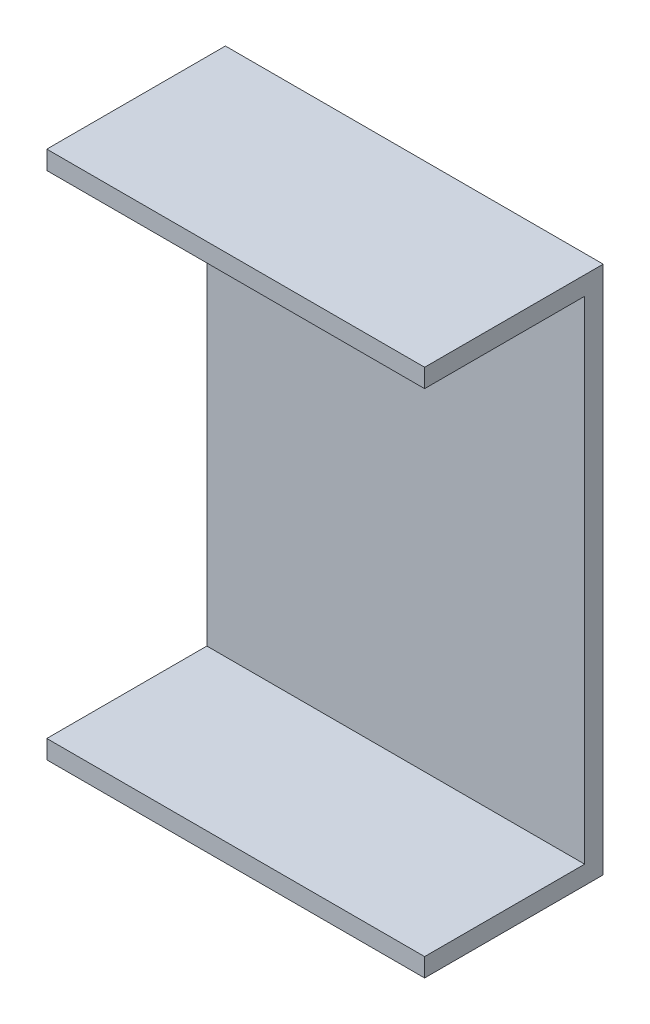
ISO-10303-21;
HEADER;
FILE_DESCRIPTION(('STEP AP214'),'2;1');
FILE_NAME('part.step','',(''),(''),'','','');
FILE_SCHEMA(('AUTOMOTIVE_DESIGN { 1 0 10303 214 1 1 1 1 }'));
ENDSEC;
DATA;
#1=APPLICATION_CONTEXT('core data for automotive mechanical design processes');
#2=APPLICATION_PROTOCOL_DEFINITION('international standard','automotive_design',2000,#1);
#3=PRODUCT_CONTEXT('',#1,'mechanical');
#4=PRODUCT('Part','Part','',(#3));
#5=PRODUCT_RELATED_PRODUCT_CATEGORY('part','',(#4));
#6=PRODUCT_DEFINITION_FORMATION('','',#4);
#7=PRODUCT_DEFINITION_CONTEXT('part definition',#1,'design');
#8=PRODUCT_DEFINITION('design','',#6,#7);
#9=PRODUCT_DEFINITION_SHAPE('','',#8);
#10=(LENGTH_UNIT() NAMED_UNIT(*) SI_UNIT(.MILLI.,.METRE.));
#11=(NAMED_UNIT(*) PLANE_ANGLE_UNIT() SI_UNIT($,.RADIAN.));
#12=(NAMED_UNIT(*) SI_UNIT($,.STERADIAN.) SOLID_ANGLE_UNIT());
#13=UNCERTAINTY_MEASURE_WITH_UNIT(LENGTH_MEASURE(1.E-05),#10,'distance_accuracy_value','');
#14=(GEOMETRIC_REPRESENTATION_CONTEXT(3) GLOBAL_UNCERTAINTY_ASSIGNED_CONTEXT((#13)) GLOBAL_UNIT_ASSIGNED_CONTEXT((#10,
#11,#12)) REPRESENTATION_CONTEXT('',''));
#15=CARTESIAN_POINT('',(0.,0.,0.));
#16=DIRECTION('',(0.,0.,1.));
#17=DIRECTION('',(1.,0.,0.));
#18=AXIS2_PLACEMENT_3D('',#15,#16,#17);
#19=CARTESIAN_POINT('',(26.8,-7.7,-30.425));
#20=DIRECTION('',(0.,0.,-1.));
#21=DIRECTION('',(0.,1.,0.));
#22=AXIS2_PLACEMENT_3D('',#19,#20,#21);
#23=PLANE('',#22);
#24=DIRECTION('',(0.,1.,0.));
#25=VECTOR('',#24,1.);
#26=CARTESIAN_POINT('',(23.8,-7.7,-30.425));
#27=LINE('',#26,#25);
#28=CARTESIAN_POINT('',(23.8,-7.16,-30.425));
#29=VERTEX_POINT('',#28);
#30=CARTESIAN_POINT('',(23.8,-7.7,-30.425));
#31=VERTEX_POINT('',#30);
#32=EDGE_CURVE('E19',#29,#31,#27,.F.);
#33=ORIENTED_EDGE('',*,*,#32,.F.);
#34=DIRECTION('',(1.,0.,0.));
#35=VECTOR('',#34,1.);
#36=CARTESIAN_POINT('',(26.8,-7.16,-30.425));
#37=LINE('',#36,#35);
#38=CARTESIAN_POINT('',(12.8,-7.16,-30.425));
#39=VERTEX_POINT('',#38);
#40=EDGE_CURVE('E92',#29,#39,#37,.F.);
#41=ORIENTED_EDGE('',*,*,#40,.T.);
#42=DIRECTION('',(0.,-1.,0.));
#43=VECTOR('',#42,1.);
#44=CARTESIAN_POINT('',(12.8,0.,-30.425));
#45=LINE('',#44,#43);
#46=CARTESIAN_POINT('',(12.8,-7.7,-30.425));
#47=VERTEX_POINT('',#46);
#48=EDGE_CURVE('E81',#47,#39,#45,.F.);
#49=ORIENTED_EDGE('',*,*,#48,.F.);
#50=DIRECTION('',(-1.,0.,0.));
#51=VECTOR('',#50,1.);
#52=CARTESIAN_POINT('',(26.8,-7.7,-30.425));
#53=LINE('',#52,#51);
#54=EDGE_CURVE('E125',#47,#31,#53,.F.);
#55=ORIENTED_EDGE('',*,*,#54,.T.);
#56=EDGE_LOOP('',(#33,#41,#49,#55));
#57=FACE_BOUND('',#56,.T.);
#58=ADVANCED_FACE('F16',(#57),#23,.F.);
#59=CARTESIAN_POINT('',(26.8,-7.16,-30.425));
#60=DIRECTION('',(0.,-1.,0.));
#61=DIRECTION('',(1.,0.,0.));
#62=AXIS2_PLACEMENT_3D('',#59,#60,#61);
#63=PLANE('',#62);
#64=DIRECTION('',(0.,0.,1.));
#65=VECTOR('',#64,1.);
#66=CARTESIAN_POINT('',(23.8,-7.16,-34.29607680126));
#67=LINE('',#66,#65);
#68=CARTESIAN_POINT('',(23.8,-7.16,-35.085));
#69=VERTEX_POINT('',#68);
#70=EDGE_CURVE('E130',#29,#69,#67,.F.);
#71=ORIENTED_EDGE('',*,*,#70,.T.);
#72=DIRECTION('',(1.,0.,0.));
#73=VECTOR('',#72,1.);
#74=CARTESIAN_POINT('',(26.8,-7.16,-35.085));
#75=LINE('',#74,#73);
#76=CARTESIAN_POINT('',(12.8,-7.16,-35.085));
#77=VERTEX_POINT('',#76);
#78=EDGE_CURVE('E96',#69,#77,#75,.F.);
#79=ORIENTED_EDGE('',*,*,#78,.T.);
#80=DIRECTION('',(0.,0.,1.));
#81=VECTOR('',#80,1.);
#82=CARTESIAN_POINT('',(12.8,-7.16,-34.29607680126));
#83=LINE('',#82,#81);
#84=EDGE_CURVE('E78',#39,#77,#83,.F.);
#85=ORIENTED_EDGE('',*,*,#84,.F.);
#86=ORIENTED_EDGE('',*,*,#40,.F.);
#87=EDGE_LOOP('',(#71,#79,#85,#86));
#88=FACE_BOUND('',#87,.T.);
#89=ADVANCED_FACE('F97',(#88),#63,.F.);
#90=CARTESIAN_POINT('',(26.8,-7.16,-35.085));
#91=DIRECTION('',(0.,0.,-1.));
#92=DIRECTION('',(0.,1.,0.));
#93=AXIS2_PLACEMENT_3D('',#90,#91,#92);
#94=PLANE('',#93);
#95=DIRECTION('',(0.,-1.,0.));
#96=VECTOR('',#95,1.);
#97=CARTESIAN_POINT('',(23.8,0.,-35.085));
#98=LINE('',#97,#96);
#99=CARTESIAN_POINT('',(23.8,7.16,-35.085));
#100=VERTEX_POINT('',#99);
#101=EDGE_CURVE('E115',#69,#100,#98,.F.);
#102=ORIENTED_EDGE('',*,*,#101,.T.);
#103=DIRECTION('',(-1.,0.,0.));
#104=VECTOR('',#103,1.);
#105=CARTESIAN_POINT('',(26.8,7.16,-35.085));
#106=LINE('',#105,#104);
#107=CARTESIAN_POINT('',(12.8,7.16,-35.085));
#108=VERTEX_POINT('',#107);
#109=EDGE_CURVE('E107',#100,#108,#106,.T.);
#110=ORIENTED_EDGE('',*,*,#109,.T.);
#111=DIRECTION('',(0.,-1.,0.));
#112=VECTOR('',#111,1.);
#113=CARTESIAN_POINT('',(12.8,0.,-35.085));
#114=LINE('',#113,#112);
#115=EDGE_CURVE('E99',#77,#108,#114,.F.);
#116=ORIENTED_EDGE('',*,*,#115,.F.);
#117=ORIENTED_EDGE('',*,*,#78,.F.);
#118=EDGE_LOOP('',(#102,#110,#116,#117));
#119=FACE_BOUND('',#118,.T.);
#120=ADVANCED_FACE('F113',(#119),#94,.F.);
#121=CARTESIAN_POINT('',(26.8,7.16,-35.085));
#122=DIRECTION('',(0.,1.,0.));
#123=DIRECTION('',(-1.,0.,0.));
#124=AXIS2_PLACEMENT_3D('',#121,#122,#123);
#125=PLANE('',#124);
#126=DIRECTION('',(0.,0.,1.));
#127=VECTOR('',#126,1.);
#128=CARTESIAN_POINT('',(23.8,7.16,-34.29607680126));
#129=LINE('',#128,#127);
#130=CARTESIAN_POINT('',(23.8,7.16,-30.425));
#131=VERTEX_POINT('',#130);
#132=EDGE_CURVE('E133',#100,#131,#129,.T.);
#133=ORIENTED_EDGE('',*,*,#132,.T.);
#134=DIRECTION('',(1.,0.,0.));
#135=VECTOR('',#134,1.);
#136=CARTESIAN_POINT('',(26.8,7.16,-30.425));
#137=LINE('',#136,#135);
#138=CARTESIAN_POINT('',(12.8,7.16,-30.425));
#139=VERTEX_POINT('',#138);
#140=EDGE_CURVE('E89',#131,#139,#137,.F.);
#141=ORIENTED_EDGE('',*,*,#140,.T.);
#142=DIRECTION('',(0.,0.,1.));
#143=VECTOR('',#142,1.);
#144=CARTESIAN_POINT('',(12.8,7.16,-34.29607680126));
#145=LINE('',#144,#143);
#146=EDGE_CURVE('E101',#108,#139,#145,.T.);
#147=ORIENTED_EDGE('',*,*,#146,.F.);
#148=ORIENTED_EDGE('',*,*,#109,.F.);
#149=EDGE_LOOP('',(#133,#141,#147,#148));
#150=FACE_BOUND('',#149,.T.);
#151=ADVANCED_FACE('F119',(#150),#125,.F.);
#152=CARTESIAN_POINT('',(26.8,7.16,-30.425));
#153=DIRECTION('',(0.,0.,-1.));
#154=DIRECTION('',(0.,1.,0.));
#155=AXIS2_PLACEMENT_3D('',#152,#153,#154);
#156=PLANE('',#155);
#157=DIRECTION('',(0.,-1.,0.));
#158=VECTOR('',#157,1.);
#159=CARTESIAN_POINT('',(23.8,0.,-30.425));
#160=LINE('',#159,#158);
#161=CARTESIAN_POINT('',(23.8,7.7,-30.425));
#162=VERTEX_POINT('',#161);
#163=EDGE_CURVE('E135',#131,#162,#160,.F.);
#164=ORIENTED_EDGE('',*,*,#163,.T.);
#165=DIRECTION('',(1.,0.,0.));
#166=VECTOR('',#165,1.);
#167=CARTESIAN_POINT('',(26.8,7.7,-30.425));
#168=LINE('',#167,#166);
#169=CARTESIAN_POINT('',(12.8,7.7,-30.425));
#170=VERTEX_POINT('',#169);
#171=EDGE_CURVE('E141',#162,#170,#168,.F.);
#172=ORIENTED_EDGE('',*,*,#171,.T.);
#173=DIRECTION('',(0.,-1.,0.));
#174=VECTOR('',#173,1.);
#175=CARTESIAN_POINT('',(12.8,0.,-30.425));
#176=LINE('',#175,#174);
#177=EDGE_CURVE('E121',#139,#170,#176,.F.);
#178=ORIENTED_EDGE('',*,*,#177,.F.);
#179=ORIENTED_EDGE('',*,*,#140,.F.);
#180=EDGE_LOOP('',(#164,#172,#178,#179));
#181=FACE_BOUND('',#180,.T.);
#182=ADVANCED_FACE('F168',(#181),#156,.F.);
#183=CARTESIAN_POINT('',(12.8,0.,-34.29607680126));
#184=DIRECTION('',(-1.,0.,0.));
#185=DIRECTION('',(0.,-1.,0.));
#186=AXIS2_PLACEMENT_3D('',#183,#184,#185);
#187=PLANE('',#186);
#188=ORIENTED_EDGE('',*,*,#146,.T.);
#189=ORIENTED_EDGE('',*,*,#177,.T.);
#190=DIRECTION('',(0.,0.,1.));
#191=VECTOR('',#190,1.);
#192=CARTESIAN_POINT('',(12.8,7.70000000000001,-30.425));
#193=LINE('',#192,#191);
#194=CARTESIAN_POINT('',(12.8,7.7,-35.625));
#195=VERTEX_POINT('',#194);
#196=EDGE_CURVE('E137',#170,#195,#193,.F.);
#197=ORIENTED_EDGE('',*,*,#196,.T.);
#198=DIRECTION('',(0.,-1.,0.));
#199=VECTOR('',#198,1.);
#200=CARTESIAN_POINT('',(12.8,7.7,-35.625));
#201=LINE('',#200,#199);
#202=CARTESIAN_POINT('',(12.8,-7.7,-35.625));
#203=VERTEX_POINT('',#202);
#204=EDGE_CURVE('E144',#195,#203,#201,.T.);
#205=ORIENTED_EDGE('',*,*,#204,.T.);
#206=DIRECTION('',(0.,0.,1.));
#207=VECTOR('',#206,1.);
#208=CARTESIAN_POINT('',(12.8,-7.69999999999999,-35.625));
#209=LINE('',#208,#207);
#210=EDGE_CURVE('E85',#203,#47,#209,.T.);
#211=ORIENTED_EDGE('',*,*,#210,.T.);
#212=ORIENTED_EDGE('',*,*,#48,.T.);
#213=ORIENTED_EDGE('',*,*,#84,.T.);
#214=ORIENTED_EDGE('',*,*,#115,.T.);
#215=EDGE_LOOP('',(#188,#189,#197,#205,#211,#212,#213,#214));
#216=FACE_BOUND('',#215,.T.);
#217=ADVANCED_FACE('F83',(#216),#187,.T.);
#218=CARTESIAN_POINT('',(26.8,-7.7,-35.625));
#219=DIRECTION('',(0.,1.,0.));
#220=DIRECTION('',(-1.,0.,0.));
#221=AXIS2_PLACEMENT_3D('',#218,#219,#220);
#222=PLANE('',#221);
#223=DIRECTION('',(0.,0.,1.));
#224=VECTOR('',#223,1.);
#225=CARTESIAN_POINT('',(23.8,-7.7,-34.29607680126));
#226=LINE('',#225,#224);
#227=CARTESIAN_POINT('',(23.8,-7.7,-35.625));
#228=VERTEX_POINT('',#227);
#229=EDGE_CURVE('E127',#228,#31,#226,.T.);
#230=ORIENTED_EDGE('',*,*,#229,.T.);
#231=ORIENTED_EDGE('',*,*,#54,.F.);
#232=ORIENTED_EDGE('',*,*,#210,.F.);
#233=DIRECTION('',(1.,0.,0.));
#234=VECTOR('',#233,1.);
#235=CARTESIAN_POINT('',(26.8,-7.7,-35.625));
#236=LINE('',#235,#234);
#237=EDGE_CURVE('E146',#203,#228,#236,.T.);
#238=ORIENTED_EDGE('',*,*,#237,.T.);
#239=EDGE_LOOP('',(#230,#231,#232,#238));
#240=FACE_BOUND('',#239,.T.);
#241=ADVANCED_FACE('F158',(#240),#222,.F.);
#242=CARTESIAN_POINT('',(23.8,0.,-34.29607680126));
#243=DIRECTION('',(-1.,0.,0.));
#244=DIRECTION('',(0.,-1.,0.));
#245=AXIS2_PLACEMENT_3D('',#242,#243,#244);
#246=PLANE('',#245);
#247=ORIENTED_EDGE('',*,*,#163,.F.);
#248=ORIENTED_EDGE('',*,*,#132,.F.);
#249=ORIENTED_EDGE('',*,*,#101,.F.);
#250=ORIENTED_EDGE('',*,*,#70,.F.);
#251=ORIENTED_EDGE('',*,*,#32,.T.);
#252=ORIENTED_EDGE('',*,*,#229,.F.);
#253=DIRECTION('',(0.,-1.,0.));
#254=VECTOR('',#253,1.);
#255=CARTESIAN_POINT('',(23.8,7.7,-35.625));
#256=LINE('',#255,#254);
#257=CARTESIAN_POINT('',(23.8,7.7,-35.625));
#258=VERTEX_POINT('',#257);
#259=EDGE_CURVE('E25',#228,#258,#256,.F.);
#260=ORIENTED_EDGE('',*,*,#259,.T.);
#261=DIRECTION('',(0.,0.,1.));
#262=VECTOR('',#261,1.);
#263=CARTESIAN_POINT('',(23.8,7.7,-30.425));
#264=LINE('',#263,#262);
#265=EDGE_CURVE('E33',#258,#162,#264,.T.);
#266=ORIENTED_EDGE('',*,*,#265,.T.);
#267=EDGE_LOOP('',(#247,#248,#249,#250,#251,#252,#260,#266));
#268=FACE_BOUND('',#267,.T.);
#269=ADVANCED_FACE('F153',(#268),#246,.F.);
#270=CARTESIAN_POINT('',(26.8,7.7,-30.425));
#271=DIRECTION('',(0.,-1.,0.));
#272=DIRECTION('',(1.,0.,0.));
#273=AXIS2_PLACEMENT_3D('',#270,#271,#272);
#274=PLANE('',#273);
#275=ORIENTED_EDGE('',*,*,#265,.F.);
#276=DIRECTION('',(1.,0.,0.));
#277=VECTOR('',#276,1.);
#278=CARTESIAN_POINT('',(26.8,7.7,-35.625));
#279=LINE('',#278,#277);
#280=EDGE_CURVE('E11',#258,#195,#279,.F.);
#281=ORIENTED_EDGE('',*,*,#280,.T.);
#282=ORIENTED_EDGE('',*,*,#196,.F.);
#283=ORIENTED_EDGE('',*,*,#171,.F.);
#284=EDGE_LOOP('',(#275,#281,#282,#283));
#285=FACE_BOUND('',#284,.T.);
#286=ADVANCED_FACE('F166',(#285),#274,.F.);
#287=CARTESIAN_POINT('',(26.8,7.7,-35.625));
#288=DIRECTION('',(0.,0.,1.));
#289=DIRECTION('',(0.,-1.,0.));
#290=AXIS2_PLACEMENT_3D('',#287,#288,#289);
#291=PLANE('',#290);
#292=ORIENTED_EDGE('',*,*,#259,.F.);
#293=ORIENTED_EDGE('',*,*,#237,.F.);
#294=ORIENTED_EDGE('',*,*,#204,.F.);
#295=ORIENTED_EDGE('',*,*,#280,.F.);
#296=EDGE_LOOP('',(#292,#293,#294,#295));
#297=FACE_BOUND('',#296,.T.);
#298=ADVANCED_FACE('F156',(#297),#291,.F.);
#299=CLOSED_SHELL('',(#58,#89,#120,#151,#182,#217,#241,#269,#286,#298));
#300=MANIFOLD_SOLID_BREP('B1',#299);
#301=ADVANCED_BREP_SHAPE_REPRESENTATION('',(#18,#300),#14);
#302=SHAPE_DEFINITION_REPRESENTATION(#9,#301);
ENDSEC;
END-ISO-10303-21;
